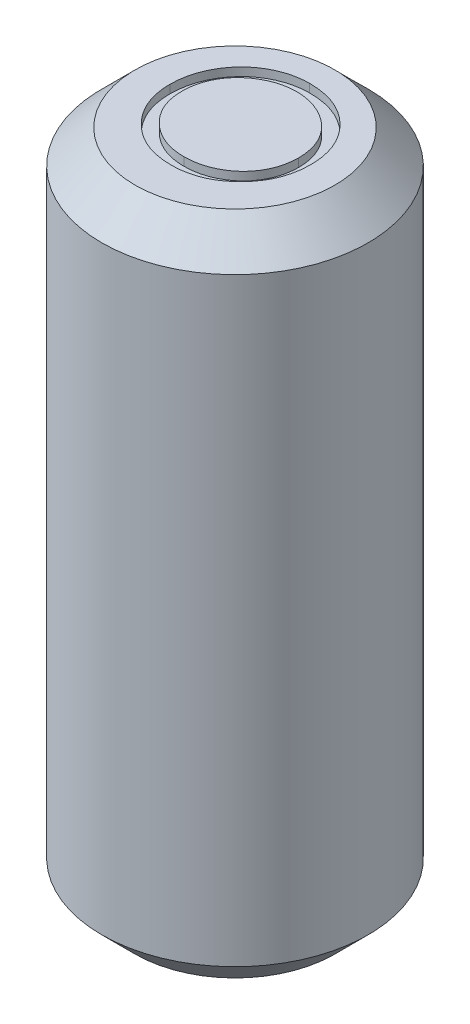
ISO-10303-21;
HEADER;
FILE_DESCRIPTION(('STEP AP214'),'2;1');
FILE_NAME('part.step','',(''),(''),'','','');
FILE_SCHEMA(('AUTOMOTIVE_DESIGN { 1 0 10303 214 1 1 1 1 }'));
ENDSEC;
DATA;
#1=APPLICATION_CONTEXT('core data for automotive mechanical design processes');
#2=APPLICATION_PROTOCOL_DEFINITION('international standard','automotive_design',2000,#1);
#3=PRODUCT_CONTEXT('',#1,'mechanical');
#4=PRODUCT('Part','Part','',(#3));
#5=PRODUCT_RELATED_PRODUCT_CATEGORY('part','',(#4));
#6=PRODUCT_DEFINITION_FORMATION('','',#4);
#7=PRODUCT_DEFINITION_CONTEXT('part definition',#1,'design');
#8=PRODUCT_DEFINITION('design','',#6,#7);
#9=PRODUCT_DEFINITION_SHAPE('','',#8);
#10=(LENGTH_UNIT() NAMED_UNIT(*) SI_UNIT(.MILLI.,.METRE.));
#11=(NAMED_UNIT(*) PLANE_ANGLE_UNIT() SI_UNIT($,.RADIAN.));
#12=(NAMED_UNIT(*) SI_UNIT($,.STERADIAN.) SOLID_ANGLE_UNIT());
#13=UNCERTAINTY_MEASURE_WITH_UNIT(LENGTH_MEASURE(1.E-05),#10,'distance_accuracy_value','');
#14=(GEOMETRIC_REPRESENTATION_CONTEXT(3) GLOBAL_UNCERTAINTY_ASSIGNED_CONTEXT((#13)) GLOBAL_UNIT_ASSIGNED_CONTEXT((#10,
#11,#12)) REPRESENTATION_CONTEXT('',''));
#15=CARTESIAN_POINT('',(0.,0.,0.));
#16=DIRECTION('',(0.,0.,1.));
#17=DIRECTION('',(1.,0.,0.));
#18=AXIS2_PLACEMENT_3D('',#15,#16,#17);
#19=CARTESIAN_POINT('',(0.,20.,0.));
#20=DIRECTION('',(0.,1.,0.));
#21=DIRECTION('',(0.,0.,1.));
#22=AXIS2_PLACEMENT_3D('',#19,#20,#21);
#23=PLANE('',#22);
#24=CARTESIAN_POINT('',(0.,20.,0.));
#25=DIRECTION('',(0.,1.,0.));
#26=DIRECTION('',(0.,0.,1.));
#27=AXIS2_PLACEMENT_3D('',#24,#25,#26);
#28=CIRCLE('',#27,3.);
#29=CARTESIAN_POINT('',(0.,20.,3.));
#30=VERTEX_POINT('',#29);
#31=EDGE_CURVE('E11',#30,#30,#28,.T.);
#32=ORIENTED_EDGE('',*,*,#31,.T.);
#33=EDGE_LOOP('',(#32));
#34=FACE_BOUND('',#33,.T.);
#35=CARTESIAN_POINT('',(0.00800634069132635,20.,1.93656942691081));
#36=CARTESIAN_POINT('',(-0.0644785952853353,20.,1.93479869907733));
#37=CARTESIAN_POINT('',(-0.207365699214886,20.,1.93130812315886));
#38=CARTESIAN_POINT('',(-0.417122311077475,20.,1.90138651767081));
#39=CARTESIAN_POINT('',(-0.618582589760647,20.,1.85459645618371));
#40=CARTESIAN_POINT('',(-0.811170419717619,20.,1.7877285290768));
#41=CARTESIAN_POINT('',(-0.9949931964016,20.,1.70130883681984));
#42=CARTESIAN_POINT('',(-1.1704104337668,20.,1.59593240360267));
#43=CARTESIAN_POINT('',(-1.33671803061441,20.,1.47089567082481));
#44=CARTESIAN_POINT('',(-1.49253716945386,20.,1.32899101416083));
#45=CARTESIAN_POINT('',(-1.63510768166237,20.,1.1745092404285));
#46=CARTESIAN_POINT('',(-1.75940411102568,20.,1.00898437748199));
#47=CARTESIAN_POINT('',(-1.86480424053333,20.,0.835663855603746));
#48=CARTESIAN_POINT('',(-1.95093376338506,20.,0.65406668518924));
#49=CARTESIAN_POINT('',(-2.01912171692187,20.,0.465070750672939));
#50=CARTESIAN_POINT('',(-2.06564150908083,20.,0.267415347827843));
#51=CARTESIAN_POINT('',(-2.09573974001665,20.,0.0622273411823689));
#52=CARTESIAN_POINT('',(-2.09920813599577,20.,-0.0774788283322625));
#53=CARTESIAN_POINT('',(-2.10096801828303,20.,-0.148366470525088));
#54=B_SPLINE_CURVE_WITH_KNOTS('',3,(#35,#36,#37,#38,#39,#40,#41,#42,#43,#44,#45,#46,#47,#48,#49,
#50,#51,#52,#53),.UNSPECIFIED.,.F.,.F.,(4,1,1,1,1,1,1,1,1,1,1,1,1,1,1,1,4),(0.,
0.065818876843307,0.129746526906831,0.192071954488006,0.253459424298202,0.31456958779642,
0.376279881188026,0.43902565366856,0.503267028829086,0.567492822879295,0.629704795605245,
0.690999649215756,0.751451650917447,0.812004364264694,0.873149681068043,0.935635483731786,1.),.UNSPECIFIED.);
#55=CARTESIAN_POINT('',(0.00800634069132635,20.,1.93656942691081));
#56=VERTEX_POINT('',#55);
#57=CARTESIAN_POINT('',(-2.10096801828303,20.,-0.148366470525088));
#58=VERTEX_POINT('',#57);
#59=EDGE_CURVE('E189',#56,#58,#54,.T.);
#60=ORIENTED_EDGE('',*,*,#59,.T.);
#61=CARTESIAN_POINT('',(-2.10096801828303,20.,-0.148366470525088));
#62=CARTESIAN_POINT('',(-2.10035700627719,20.,-0.195946663824122));
#63=CARTESIAN_POINT('',(-2.0991426904556,20.,-0.290506804974538));
#64=CARTESIAN_POINT('',(-2.08452361334838,20.,-0.430925776577204));
#65=CARTESIAN_POINT('',(-2.06331024054069,20.,-0.569086528310917));
#66=CARTESIAN_POINT('',(-2.03290805476995,20.,-0.704596183127278));
#67=CARTESIAN_POINT('',(-1.99314614964253,20.,-0.837123022787051));
#68=CARTESIAN_POINT('',(-1.9462295469108,20.,-0.96758103745716));
#69=CARTESIAN_POINT('',(-1.88892686650221,20.,-1.09464815030907));
#70=CARTESIAN_POINT('',(-1.82414898302925,20.,-1.21892631226464));
#71=CARTESIAN_POINT('',(-1.7518497738603,20.,-1.33847820464897));
#72=CARTESIAN_POINT('',(-1.67199177448661,20.,-1.45148344253597));
#73=CARTESIAN_POINT('',(-1.58737992480904,20.,-1.5588902960014));
#74=CARTESIAN_POINT('',(-1.4946217606627,20.,-1.65791544324601));
#75=CARTESIAN_POINT('',(-1.39677439472501,20.,-1.75143962197737));
#76=CARTESIAN_POINT('',(-1.29225053400018,20.,-1.83802558428619));
#77=CARTESIAN_POINT('',(-1.18168796901098,20.,-1.9184540996651));
#78=CARTESIAN_POINT('',(-1.06461096356459,20.,-1.99093448947131));
#79=CARTESIAN_POINT('',(-0.943904363702241,20.,-2.05648778617513));
#80=CARTESIAN_POINT('',(-0.819473760525815,20.,-2.1127413301554));
#81=CARTESIAN_POINT('',(-0.693009107376504,20.,-2.16102254331031));
#82=CARTESIAN_POINT('',(-0.563918081175945,20.,-2.20015491496406));
#83=CARTESIAN_POINT('',(-0.4325434845127,20.,-2.23104867038349));
#84=CARTESIAN_POINT('',(-0.298598587857987,20.,-2.25208564605075));
#85=CARTESIAN_POINT('',(-0.162190100681486,20.,-2.26674200935073));
#86=CARTESIAN_POINT('',(-0.070291450452931,20.,-2.2679505830528));
#87=CARTESIAN_POINT('',(-0.0240449413599557,20.,-2.2685587782174));
#88=B_SPLINE_CURVE_WITH_KNOTS('',3,(#61,#62,#63,#64,#65,#66,#67,#68,#69,#70,#71,#72,#73,#74,#75,
#76,#77,#78,#79,#80,#81,#82,#83,#84,#85,#86,#87),.UNSPECIFIED.,.F.,.F.,(4,1,1,1,1,1,1,1,1,1,1,1,
1,1,1,1,1,1,1,1,1,1,1,1,4),(0.,0.0432089861713366,0.0858728716306187,0.128120006696703,
0.170151964454199,0.211917620987861,0.253753002619124,0.296006408855951,0.338443357144784,
0.381015368162034,0.422820479440761,0.464089055794313,0.505125848683686,0.545974970685241,
0.58698521113386,0.628338591634663,0.670083801591206,0.711991602363722,0.753039154863019,
0.794049395311638,0.834885542701582,0.875498312929513,0.916547299830379,0.958003778644961,1.),.UNSPECIFIED.);
#89=CARTESIAN_POINT('',(-0.0240449413599557,20.,-2.2685587782174));
#90=VERTEX_POINT('',#89);
#91=EDGE_CURVE('E48',#58,#90,#88,.T.);
#92=ORIENTED_EDGE('',*,*,#91,.T.);
#93=CARTESIAN_POINT('',(-0.0240449413599557,20.,-2.2685587782174));
#94=CARTESIAN_POINT('',(0.0500214653920823,20.,-2.26668280179332));
#95=CARTESIAN_POINT('',(0.195493999056144,20.,-2.26299822932017));
#96=CARTESIAN_POINT('',(0.409293882169266,20.,-2.2347935395426));
#97=CARTESIAN_POINT('',(0.613402562494487,20.,-2.18599880815166));
#98=CARTESIAN_POINT('',(0.80948272112509,20.,-2.12101254245939));
#99=CARTESIAN_POINT('',(0.99518898006132,20.,-2.03432181630993));
#100=CARTESIAN_POINT('',(1.1719191429077,20.,-1.9295387896362));
#101=CARTESIAN_POINT('',(1.33925271299407,20.,-1.80556569391247));
#102=CARTESIAN_POINT('',(1.49493429188368,20.,-1.66336086322492));
#103=CARTESIAN_POINT('',(1.63739937792163,20.,-1.50863691590884));
#104=CARTESIAN_POINT('',(1.76291467651509,20.,-1.34351930439693));
#105=CARTESIAN_POINT('',(1.86810586935134,20.,-1.16900638747503));
#106=CARTESIAN_POINT('',(1.95448962611162,20.,-0.985622581027338));
#107=CARTESIAN_POINT('',(2.0222594657617,20.,-0.793782617627749));
#108=CARTESIAN_POINT('',(2.06902408712239,20.,-0.592463757351888));
#109=CARTESIAN_POINT('',(2.09889625872575,20.,-0.382970397269541));
#110=CARTESIAN_POINT('',(2.10238857576284,20.,-0.240082551870973));
#111=CARTESIAN_POINT('',(2.10416018684517,20.,-0.167597239755858));
#112=B_SPLINE_CURVE_WITH_KNOTS('',3,(#93,#94,#95,#96,#97,#98,#99,#100,#101,#102,#103,#104,#105,
#106,#107,#108,#109,#110,#111),.UNSPECIFIED.,.F.,.F.,(4,1,1,1,1,1,1,1,1,1,1,1,1,1,1,1,4),(0.,
0.0665700352151801,0.130749041482178,0.193412800029504,0.254989398889709,0.3161135558759,
0.377261757908984,0.439400784155553,0.502970589371976,0.566524976360731,0.628231102513309,
0.689090610599863,0.749344668995804,0.810169593372207,0.871609824317044,0.934869184072764,1.),.UNSPECIFIED.);
#113=CARTESIAN_POINT('',(2.10416018684517,20.,-0.167597239755858));
#114=VERTEX_POINT('',#113);
#115=EDGE_CURVE('E173',#90,#114,#112,.T.);
#116=ORIENTED_EDGE('',*,*,#115,.T.);
#117=CARTESIAN_POINT('',(2.10416018684517,20.,-0.167597239755858));
#118=CARTESIAN_POINT('',(2.10238883538907,20.,-0.095645872491213));
#119=CARTESIAN_POINT('',(2.09889729645682,20.,0.0461786080024725));
#120=CARTESIAN_POINT('',(2.0689901221305,20.,0.254342544197576));
#121=CARTESIAN_POINT('',(2.02208612216019,20.,0.454446197320116));
#122=CARTESIAN_POINT('',(1.95511896080863,20.,0.646155514777172));
#123=CARTESIAN_POINT('',(1.86914698542202,20.,0.829672730508615));
#124=CARTESIAN_POINT('',(1.76325536127237,20.,1.00451496351645));
#125=CARTESIAN_POINT('',(1.63852254899564,20.,1.17073953310035));
#126=CARTESIAN_POINT('',(1.49657186210042,20.,1.32652543621313));
#127=CARTESIAN_POINT('',(1.34182781408436,20.,1.46937968843439));
#128=CARTESIAN_POINT('',(1.17585036630269,20.,1.59385840350144));
#129=CARTESIAN_POINT('',(1.00237228639181,20.,1.70097168875732));
#130=CARTESIAN_POINT('',(0.819161191352543,20.,1.78643874471759));
#131=CARTESIAN_POINT('',(0.628646863550889,20.,1.85474951094054));
#132=CARTESIAN_POINT('',(0.429124208592603,20.,1.90132394526212));
#133=CARTESIAN_POINT('',(0.221528146832157,20.,1.93136628040733));
#134=CARTESIAN_POINT('',(0.0799612853434925,20.,1.93481601293665));
#135=CARTESIAN_POINT('',(0.00800634069132635,20.,1.93656942691081));
#136=B_SPLINE_CURVE_WITH_KNOTS('',3,(#117,#118,#119,#120,#121,#122,#123,#124,#125,#126,#127,
#128,#129,#130,#131,#132,#133,#134,#135),.UNSPECIFIED.,.F.,.F.,(4,1,1,1,1,1,1,1,1,1,1,1,1,1,1,1,
4),(0.,0.0652265038922758,0.128568995706729,0.190320378104467,0.251377988624063,
0.312387528333694,0.373788704276724,0.43643115978045,0.500566755309854,0.564686795384744,
0.627135517883514,0.68845540889498,0.749245746463747,0.810155177364678,0.871670925652923,
0.934773496107724,1.),.UNSPECIFIED.);
#137=EDGE_CURVE('E181',#114,#56,#136,.T.);
#138=ORIENTED_EDGE('',*,*,#137,.T.);
#139=EDGE_LOOP('',(#60,#92,#116,#138));
#140=FACE_BOUND('',#139,.T.);
#141=ADVANCED_FACE('F33',(#34,#140),#23,.T.);
#142=CARTESIAN_POINT('',(0.,20.,0.));
#143=DIRECTION('',(0.,-1.,0.));
#144=DIRECTION('',(0.,0.,-1.));
#145=AXIS2_PLACEMENT_3D('',#142,#143,#144);
#146=CYLINDRICAL_SURFACE('',#145,4.);
#147=CARTESIAN_POINT('',(0.,1.,0.));
#148=DIRECTION('',(0.,1.,0.));
#149=DIRECTION('',(0.,0.,1.));
#150=AXIS2_PLACEMENT_3D('',#147,#148,#149);
#151=CIRCLE('',#150,4.);
#152=CARTESIAN_POINT('',(0.,1.,4.));
#153=VERTEX_POINT('',#152);
#154=EDGE_CURVE('E211',#153,#153,#151,.T.);
#155=ORIENTED_EDGE('',*,*,#154,.T.);
#156=EDGE_LOOP('',(#155));
#157=FACE_BOUND('',#156,.T.);
#158=CARTESIAN_POINT('',(0.,19.,0.));
#159=DIRECTION('',(0.,1.,0.));
#160=DIRECTION('',(0.,0.,1.));
#161=AXIS2_PLACEMENT_3D('',#158,#159,#160);
#162=CIRCLE('',#161,4.);
#163=CARTESIAN_POINT('',(0.,19.,4.));
#164=VERTEX_POINT('',#163);
#165=EDGE_CURVE('E208',#164,#164,#162,.F.);
#166=ORIENTED_EDGE('',*,*,#165,.T.);
#167=EDGE_LOOP('',(#166));
#168=FACE_BOUND('',#167,.T.);
#169=ADVANCED_FACE('F223',(#157,#168),#146,.T.);
#170=CARTESIAN_POINT('',(0.,0.,0.));
#171=DIRECTION('',(0.,1.,0.));
#172=DIRECTION('',(0.,0.,1.));
#173=AXIS2_PLACEMENT_3D('',#170,#171,#172);
#174=PLANE('',#173);
#175=CARTESIAN_POINT('',(0.,0.,0.));
#176=DIRECTION('',(0.,1.,0.));
#177=DIRECTION('',(0.,0.,1.));
#178=AXIS2_PLACEMENT_3D('',#175,#176,#177);
#179=CIRCLE('',#178,2.99999999999999);
#180=CARTESIAN_POINT('',(0.,0.,2.99999999999999));
#181=VERTEX_POINT('',#180);
#182=EDGE_CURVE('E41',#181,#181,#179,.F.);
#183=ORIENTED_EDGE('',*,*,#182,.T.);
#184=EDGE_LOOP('',(#183));
#185=FACE_BOUND('',#184,.T.);
#186=ADVANCED_FACE('F216',(#185),#174,.F.);
#187=CARTESIAN_POINT('',(0.,1.,0.));
#188=DIRECTION('',(0.,1.,0.));
#189=DIRECTION('',(0.,0.,1.));
#190=AXIS2_PLACEMENT_3D('',#187,#188,#189);
#191=CONICAL_SURFACE('',#190,4.,0.785398163397451);
#192=ORIENTED_EDGE('',*,*,#182,.F.);
#193=EDGE_LOOP('',(#192));
#194=FACE_BOUND('',#193,.T.);
#195=ORIENTED_EDGE('',*,*,#154,.F.);
#196=EDGE_LOOP('',(#195));
#197=FACE_BOUND('',#196,.T.);
#198=ADVANCED_FACE('F218',(#194,#197),#191,.T.);
#199=CARTESIAN_POINT('',(0.,20.,0.));
#200=DIRECTION('',(0.,-1.,0.));
#201=DIRECTION('',(0.,0.,-1.));
#202=AXIS2_PLACEMENT_3D('',#199,#200,#201);
#203=CONICAL_SURFACE('',#202,3.,0.785398163397446);
#204=ORIENTED_EDGE('',*,*,#165,.F.);
#205=EDGE_LOOP('',(#204));
#206=FACE_BOUND('',#205,.T.);
#207=ORIENTED_EDGE('',*,*,#31,.F.);
#208=EDGE_LOOP('',(#207));
#209=FACE_BOUND('',#208,.T.);
#210=ADVANCED_FACE('F35',(#206,#209),#203,.T.);
#211=CARTESIAN_POINT('',(-2.10096801828303,19.75,-0.148366470525088));
#212=CARTESIAN_POINT('',(-2.10035700627719,19.75,-0.195946663824122));
#213=CARTESIAN_POINT('',(-2.0991426904556,19.75,-0.290506804974538));
#214=CARTESIAN_POINT('',(-2.08452361334838,19.75,-0.430925776577204));
#215=CARTESIAN_POINT('',(-2.06331024054069,19.75,-0.569086528310917));
#216=CARTESIAN_POINT('',(-2.03290805476995,19.75,-0.704596183127278));
#217=CARTESIAN_POINT('',(-1.99314614964253,19.75,-0.837123022787051));
#218=CARTESIAN_POINT('',(-1.9462295469108,19.75,-0.96758103745716));
#219=CARTESIAN_POINT('',(-1.88892686650221,19.75,-1.09464815030907));
#220=CARTESIAN_POINT('',(-1.82414898302925,19.75,-1.21892631226464));
#221=CARTESIAN_POINT('',(-1.7518497738603,19.75,-1.33847820464897));
#222=CARTESIAN_POINT('',(-1.67199177448661,19.75,-1.45148344253597));
#223=CARTESIAN_POINT('',(-1.58737992480904,19.75,-1.5588902960014));
#224=CARTESIAN_POINT('',(-1.4946217606627,19.75,-1.65791544324601));
#225=CARTESIAN_POINT('',(-1.39677439472501,19.75,-1.75143962197737));
#226=CARTESIAN_POINT('',(-1.29225053400018,19.75,-1.83802558428619));
#227=CARTESIAN_POINT('',(-1.18168796901098,19.75,-1.9184540996651));
#228=CARTESIAN_POINT('',(-1.06461096356459,19.75,-1.99093448947131));
#229=CARTESIAN_POINT('',(-0.943904363702241,19.75,-2.05648778617513));
#230=CARTESIAN_POINT('',(-0.819473760525815,19.75,-2.1127413301554));
#231=CARTESIAN_POINT('',(-0.693009107376504,19.75,-2.16102254331031));
#232=CARTESIAN_POINT('',(-0.563918081175945,19.75,-2.20015491496406));
#233=CARTESIAN_POINT('',(-0.4325434845127,19.75,-2.23104867038349));
#234=CARTESIAN_POINT('',(-0.298598587857987,19.75,-2.25208564605075));
#235=CARTESIAN_POINT('',(-0.162190100681486,19.75,-2.26674200935073));
#236=CARTESIAN_POINT('',(-0.070291450452931,19.75,-2.2679505830528));
#237=CARTESIAN_POINT('',(-0.0240449413599557,19.75,-2.2685587782174));
#238=B_SPLINE_CURVE_WITH_KNOTS('',3,(#211,#212,#213,#214,#215,#216,#217,#218,#219,#220,#221,
#222,#223,#224,#225,#226,#227,#228,#229,#230,#231,#232,#233,#234,#235,#236,#237),.UNSPECIFIED.,
.F.,.F.,(4,1,1,1,1,1,1,1,1,1,1,1,1,1,1,1,1,1,1,1,1,1,1,1,4),(0.,0.0432089861713366,
0.0858728716306187,0.128120006696703,0.170151964454199,0.211917620987861,0.253753002619124,
0.296006408855951,0.338443357144784,0.381015368162034,0.422820479440761,0.464089055794313,
0.505125848683686,0.545974970685241,0.58698521113386,0.628338591634663,0.670083801591206,
0.711991602363722,0.753039154863019,0.794049395311638,0.834885542701582,0.875498312929513,
0.916547299830379,0.958003778644961,1.),.UNSPECIFIED.);
#239=DIRECTION('',(0.,1.,0.));
#240=VECTOR('',#239,1.);
#241=SURFACE_OF_LINEAR_EXTRUSION('',#238,#240);
#242=ORIENTED_EDGE('',*,*,#91,.F.);
#243=DIRECTION('',(0.,1.,0.));
#244=VECTOR('',#243,1.);
#245=CARTESIAN_POINT('',(-2.10096801828303,19.75,-0.148366470525088));
#246=LINE('',#245,#244);
#247=CARTESIAN_POINT('',(-2.10096801828303,19.75,-0.148366470525088));
#248=VERTEX_POINT('',#247);
#249=EDGE_CURVE('E161',#248,#58,#246,.T.);
#250=ORIENTED_EDGE('',*,*,#249,.F.);
#251=CARTESIAN_POINT('',(-0.0240449413599557,19.75,-2.2685587782174));
#252=VERTEX_POINT('',#251);
#253=EDGE_CURVE('E197',#248,#252,#238,.T.);
#254=ORIENTED_EDGE('',*,*,#253,.T.);
#255=DIRECTION('',(0.,1.,0.));
#256=VECTOR('',#255,1.);
#257=CARTESIAN_POINT('',(-0.0240449413599557,19.75,-2.2685587782174));
#258=LINE('',#257,#256);
#259=EDGE_CURVE('E206',#252,#90,#258,.T.);
#260=ORIENTED_EDGE('',*,*,#259,.T.);
#261=EDGE_LOOP('',(#242,#250,#254,#260));
#262=FACE_BOUND('',#261,.T.);
#263=ADVANCED_FACE('F231',(#262),#241,.T.);
#264=CARTESIAN_POINT('',(-0.0240449413599557,19.75,-2.2685587782174));
#265=CARTESIAN_POINT('',(0.0500214653920823,19.75,-2.26668280179332));
#266=CARTESIAN_POINT('',(0.195493999056144,19.75,-2.26299822932017));
#267=CARTESIAN_POINT('',(0.409293882169266,19.75,-2.2347935395426));
#268=CARTESIAN_POINT('',(0.613402562494487,19.75,-2.18599880815166));
#269=CARTESIAN_POINT('',(0.80948272112509,19.75,-2.12101254245939));
#270=CARTESIAN_POINT('',(0.99518898006132,19.75,-2.03432181630993));
#271=CARTESIAN_POINT('',(1.1719191429077,19.75,-1.9295387896362));
#272=CARTESIAN_POINT('',(1.33925271299407,19.75,-1.80556569391247));
#273=CARTESIAN_POINT('',(1.49493429188368,19.75,-1.66336086322492));
#274=CARTESIAN_POINT('',(1.63739937792163,19.75,-1.50863691590884));
#275=CARTESIAN_POINT('',(1.76291467651509,19.75,-1.34351930439693));
#276=CARTESIAN_POINT('',(1.86810586935134,19.75,-1.16900638747503));
#277=CARTESIAN_POINT('',(1.95448962611162,19.75,-0.985622581027338));
#278=CARTESIAN_POINT('',(2.0222594657617,19.75,-0.793782617627749));
#279=CARTESIAN_POINT('',(2.06902408712239,19.75,-0.592463757351888));
#280=CARTESIAN_POINT('',(2.09889625872575,19.75,-0.382970397269541));
#281=CARTESIAN_POINT('',(2.10238857576284,19.75,-0.240082551870973));
#282=CARTESIAN_POINT('',(2.10416018684517,19.75,-0.167597239755858));
#283=B_SPLINE_CURVE_WITH_KNOTS('',3,(#264,#265,#266,#267,#268,#269,#270,#271,#272,#273,#274,
#275,#276,#277,#278,#279,#280,#281,#282),.UNSPECIFIED.,.F.,.F.,(4,1,1,1,1,1,1,1,1,1,1,1,1,1,1,1,
4),(0.,0.0665700352151801,0.130749041482178,0.193412800029504,0.254989398889709,0.3161135558759,
0.377261757908984,0.439400784155553,0.502970589371976,0.566524976360731,0.628231102513309,
0.689090610599863,0.749344668995804,0.810169593372207,0.871609824317044,0.934869184072764,1.),.UNSPECIFIED.);
#284=DIRECTION('',(0.,1.,0.));
#285=VECTOR('',#284,1.);
#286=SURFACE_OF_LINEAR_EXTRUSION('',#283,#285);
#287=ORIENTED_EDGE('',*,*,#115,.F.);
#288=ORIENTED_EDGE('',*,*,#259,.F.);
#289=CARTESIAN_POINT('',(2.10416018684517,19.75,-0.167597239755858));
#290=VERTEX_POINT('',#289);
#291=EDGE_CURVE('E246',#252,#290,#283,.T.);
#292=ORIENTED_EDGE('',*,*,#291,.T.);
#293=DIRECTION('',(0.,1.,0.));
#294=VECTOR('',#293,1.);
#295=CARTESIAN_POINT('',(2.10416018684517,19.75,-0.167597239755858));
#296=LINE('',#295,#294);
#297=EDGE_CURVE('E204',#290,#114,#296,.T.);
#298=ORIENTED_EDGE('',*,*,#297,.T.);
#299=EDGE_LOOP('',(#287,#288,#292,#298));
#300=FACE_BOUND('',#299,.T.);
#301=ADVANCED_FACE('F260',(#300),#286,.T.);
#302=CARTESIAN_POINT('',(2.10416018684517,19.75,-0.167597239755858));
#303=CARTESIAN_POINT('',(2.10238883538907,19.75,-0.095645872491213));
#304=CARTESIAN_POINT('',(2.09889729645682,19.75,0.0461786080024725));
#305=CARTESIAN_POINT('',(2.0689901221305,19.75,0.254342544197576));
#306=CARTESIAN_POINT('',(2.02208612216019,19.75,0.454446197320116));
#307=CARTESIAN_POINT('',(1.95511896080863,19.75,0.646155514777172));
#308=CARTESIAN_POINT('',(1.86914698542202,19.75,0.829672730508615));
#309=CARTESIAN_POINT('',(1.76325536127237,19.75,1.00451496351645));
#310=CARTESIAN_POINT('',(1.63852254899564,19.75,1.17073953310035));
#311=CARTESIAN_POINT('',(1.49657186210042,19.75,1.32652543621313));
#312=CARTESIAN_POINT('',(1.34182781408436,19.75,1.46937968843439));
#313=CARTESIAN_POINT('',(1.17585036630269,19.75,1.59385840350144));
#314=CARTESIAN_POINT('',(1.00237228639181,19.75,1.70097168875732));
#315=CARTESIAN_POINT('',(0.819161191352543,19.75,1.78643874471759));
#316=CARTESIAN_POINT('',(0.628646863550889,19.75,1.85474951094054));
#317=CARTESIAN_POINT('',(0.429124208592603,19.75,1.90132394526212));
#318=CARTESIAN_POINT('',(0.221528146832157,19.75,1.93136628040733));
#319=CARTESIAN_POINT('',(0.0799612853434925,19.75,1.93481601293665));
#320=CARTESIAN_POINT('',(0.00800634069132635,19.75,1.93656942691081));
#321=B_SPLINE_CURVE_WITH_KNOTS('',3,(#302,#303,#304,#305,#306,#307,#308,#309,#310,#311,#312,
#313,#314,#315,#316,#317,#318,#319,#320),.UNSPECIFIED.,.F.,.F.,(4,1,1,1,1,1,1,1,1,1,1,1,1,1,1,1,
4),(0.,0.0652265038922758,0.128568995706729,0.190320378104467,0.251377988624063,
0.312387528333694,0.373788704276724,0.43643115978045,0.500566755309854,0.564686795384744,
0.627135517883514,0.68845540889498,0.749245746463747,0.810155177364678,0.871670925652923,
0.934773496107724,1.),.UNSPECIFIED.);
#322=DIRECTION('',(0.,1.,0.));
#323=VECTOR('',#322,1.);
#324=SURFACE_OF_LINEAR_EXTRUSION('',#321,#323);
#325=ORIENTED_EDGE('',*,*,#137,.F.);
#326=ORIENTED_EDGE('',*,*,#297,.F.);
#327=CARTESIAN_POINT('',(0.00800634069132635,19.75,1.93656942691081));
#328=VERTEX_POINT('',#327);
#329=EDGE_CURVE('E162',#290,#328,#321,.T.);
#330=ORIENTED_EDGE('',*,*,#329,.T.);
#331=DIRECTION('',(0.,1.,0.));
#332=VECTOR('',#331,1.);
#333=CARTESIAN_POINT('',(0.00800634069132635,19.75,1.93656942691081));
#334=LINE('',#333,#332);
#335=EDGE_CURVE('E202',#328,#56,#334,.T.);
#336=ORIENTED_EDGE('',*,*,#335,.T.);
#337=EDGE_LOOP('',(#325,#326,#330,#336));
#338=FACE_BOUND('',#337,.T.);
#339=ADVANCED_FACE('F152',(#338),#324,.T.);
#340=CARTESIAN_POINT('',(0.00800634069132635,19.75,1.93656942691081));
#341=CARTESIAN_POINT('',(-0.0644785952853353,19.75,1.93479869907733));
#342=CARTESIAN_POINT('',(-0.207365699214886,19.75,1.93130812315886));
#343=CARTESIAN_POINT('',(-0.417122311077475,19.75,1.90138651767081));
#344=CARTESIAN_POINT('',(-0.618582589760647,19.75,1.85459645618371));
#345=CARTESIAN_POINT('',(-0.811170419717619,19.75,1.7877285290768));
#346=CARTESIAN_POINT('',(-0.9949931964016,19.75,1.70130883681984));
#347=CARTESIAN_POINT('',(-1.1704104337668,19.75,1.59593240360267));
#348=CARTESIAN_POINT('',(-1.33671803061441,19.75,1.47089567082481));
#349=CARTESIAN_POINT('',(-1.49253716945386,19.75,1.32899101416083));
#350=CARTESIAN_POINT('',(-1.63510768166237,19.75,1.1745092404285));
#351=CARTESIAN_POINT('',(-1.75940411102568,19.75,1.00898437748199));
#352=CARTESIAN_POINT('',(-1.86480424053333,19.75,0.835663855603746));
#353=CARTESIAN_POINT('',(-1.95093376338506,19.75,0.65406668518924));
#354=CARTESIAN_POINT('',(-2.01912171692187,19.75,0.465070750672939));
#355=CARTESIAN_POINT('',(-2.06564150908083,19.75,0.267415347827843));
#356=CARTESIAN_POINT('',(-2.09573974001665,19.75,0.0622273411823689));
#357=CARTESIAN_POINT('',(-2.09920813599577,19.75,-0.0774788283322625));
#358=CARTESIAN_POINT('',(-2.10096801828303,19.75,-0.148366470525088));
#359=B_SPLINE_CURVE_WITH_KNOTS('',3,(#340,#341,#342,#343,#344,#345,#346,#347,#348,#349,#350,
#351,#352,#353,#354,#355,#356,#357,#358),.UNSPECIFIED.,.F.,.F.,(4,1,1,1,1,1,1,1,1,1,1,1,1,1,1,1,
4),(0.,0.065818876843307,0.129746526906831,0.192071954488006,0.253459424298202,0.31456958779642,
0.376279881188026,0.43902565366856,0.503267028829086,0.567492822879295,0.629704795605245,
0.690999649215756,0.751451650917447,0.812004364264694,0.873149681068043,0.935635483731786,1.),.UNSPECIFIED.);
#360=DIRECTION('',(0.,1.,0.));
#361=VECTOR('',#360,1.);
#362=SURFACE_OF_LINEAR_EXTRUSION('',#359,#361);
#363=ORIENTED_EDGE('',*,*,#59,.F.);
#364=ORIENTED_EDGE('',*,*,#335,.F.);
#365=EDGE_CURVE('E156',#328,#248,#359,.T.);
#366=ORIENTED_EDGE('',*,*,#365,.T.);
#367=ORIENTED_EDGE('',*,*,#249,.T.);
#368=EDGE_LOOP('',(#363,#364,#366,#367));
#369=FACE_BOUND('',#368,.T.);
#370=ADVANCED_FACE('F148',(#369),#362,.T.);
#371=CARTESIAN_POINT('',(-1.50546718282967,19.75,-1.64510565204306));
#372=DIRECTION('',(1.8783822154156E-12,1.,0.));
#373=DIRECTION('',(-1.,1.8783822154156E-12,0.));
#374=AXIS2_PLACEMENT_3D('',#371,#372,#373);
#375=PLANE('',#374);
#376=CARTESIAN_POINT('',(-0.00641673623175045,19.75,1.5263130166544));
#377=CARTESIAN_POINT('',(0.0331369798964824,19.75,1.52576958309305));
#378=CARTESIAN_POINT('',(0.111583878610247,19.75,1.52469179112513));
#379=CARTESIAN_POINT('',(0.228264475584859,19.75,1.51383616045445));
#380=CARTESIAN_POINT('',(0.342843003277379,19.75,1.49642830969084));
#381=CARTESIAN_POINT('',(0.455158751711982,19.75,1.47136470328072));
#382=CARTESIAN_POINT('',(0.565084250439377,19.75,1.43999646736291));
#383=CARTESIAN_POINT('',(0.673078311142173,19.75,1.40273049255254));
#384=CARTESIAN_POINT('',(0.777990642935927,19.75,1.35623768834322));
#385=CARTESIAN_POINT('',(0.881144743280129,19.75,1.30486860082434));
#386=CARTESIAN_POINT('',(0.979883305212891,19.75,1.2463084207862));
#387=CARTESIAN_POINT('',(1.07414105640241,19.75,1.18340767831842));
#388=CARTESIAN_POINT('',(1.16154217623656,19.75,1.11372925465005));
#389=CARTESIAN_POINT('',(1.24427254357477,19.75,1.04022318317119));
#390=CARTESIAN_POINT('',(1.32156133099487,19.75,0.961407357048671));
#391=CARTESIAN_POINT('',(1.39288588439505,19.75,0.877384246366508));
#392=CARTESIAN_POINT('',(1.45800603542379,19.75,0.787623495242899));
#393=CARTESIAN_POINT('',(1.51796677440552,19.75,0.693583031539721));
#394=CARTESIAN_POINT('',(1.571456217555,19.75,0.595301599899484));
#395=CARTESIAN_POINT('',(1.61806090218256,19.75,0.494124825101335));
#396=CARTESIAN_POINT('',(1.6575993202771,19.75,0.390301842967975));
#397=CARTESIAN_POINT('',(1.68951761151054,19.75,0.283682904132125));
#398=CARTESIAN_POINT('',(1.71452956771986,19.75,0.174470505536883));
#399=CARTESIAN_POINT('',(1.73176376190041,19.75,0.0625184162096262));
#400=CARTESIAN_POINT('',(1.74381912035412,19.75,-0.0519494037790663));
#401=CARTESIAN_POINT('',(1.74472777999603,19.75,-0.129370953449612));
#402=CARTESIAN_POINT('',(1.74518582787081,19.75,-0.16839852180714));
#403=B_SPLINE_CURVE_WITH_KNOTS('',3,(#376,#377,#378,#379,#380,#381,#382,#383,#384,#385,#386,
#387,#388,#389,#390,#391,#392,#393,#394,#395,#396,#397,#398,#399,#400,#401,#402),.UNSPECIFIED.,
.F.,.F.,(4,1,1,1,1,1,1,1,1,1,1,1,1,1,1,1,1,1,1,1,1,1,1,1,4),(0.,0.0436332182657581,
0.0865377766972012,0.129177336089892,0.171436323663829,0.213415894570908,0.25526595455385,
0.297369481156624,0.339940747898555,0.382347458751812,0.423952946815271,0.464871163261017,
0.505572294118273,0.546002577108316,0.586567974806913,0.627064799148168,0.668270684033174,
0.709549224850334,0.750428153513189,0.791096194448593,0.832027144779434,0.873135955335967,
0.914610764365449,0.956955986480437,1.),.UNSPECIFIED.);
#404=CARTESIAN_POINT('',(-0.00641673623175045,19.75,1.5263130166544));
#405=VERTEX_POINT('',#404);
#406=CARTESIAN_POINT('',(1.74518582787081,19.75,-0.16839852180714));
#407=VERTEX_POINT('',#406);
#408=EDGE_CURVE('E112',#405,#407,#403,.T.);
#409=ORIENTED_EDGE('',*,*,#408,.F.);
#410=CARTESIAN_POINT('',(-1.74199365930867,19.75,-0.149969034627653));
#411=CARTESIAN_POINT('',(-1.74053667421434,19.75,-0.0921836394242119));
#412=CARTESIAN_POINT('',(-1.73767033380052,19.75,0.0214981094447095));
#413=CARTESIAN_POINT('',(-1.71257596795445,19.75,0.188090273884642));
#414=CARTESIAN_POINT('',(-1.6739222828655,19.75,0.348191172563486));
#415=CARTESIAN_POINT('',(-1.61694243550926,19.75,0.500924783184649));
#416=CARTESIAN_POINT('',(-1.54568459018624,19.75,0.647603963563587));
#417=CARTESIAN_POINT('',(-1.45765385844376,19.75,0.786927511777803));
#418=CARTESIAN_POINT('',(-1.35335776065058,19.75,0.918933082479156));
#419=CARTESIAN_POINT('',(-1.23488515881995,19.75,1.04269910415885));
#420=CARTESIAN_POINT('',(-1.10537349413471,19.75,1.15566573757544));
#421=CARTESIAN_POINT('',(-0.967850374215868,19.75,1.25482391888411));
#422=CARTESIAN_POINT('',(-0.823789108516101,19.75,1.33872134725381));
#423=CARTESIAN_POINT('',(-0.672814019701838,19.75,1.40707000140625));
#424=CARTESIAN_POINT('',(-0.515731117954029,19.75,1.46122970174796));
#425=CARTESIAN_POINT('',(-0.35152820248267,19.75,1.49834813732229));
#426=CARTESIAN_POINT('',(-0.18129910581568,19.75,1.52277722917131));
#427=CARTESIAN_POINT('',(-0.0652640713469909,19.75,1.52512323593832));
#428=CARTESIAN_POINT('',(-0.00641673623175045,19.75,1.5263130166544));
#429=B_SPLINE_CURVE_WITH_KNOTS('',3,(#410,#411,#412,#413,#414,#415,#416,#417,#418,#419,#420,
#421,#422,#423,#424,#425,#426,#427,#428),.UNSPECIFIED.,.F.,.F.,(4,1,1,1,1,1,1,1,1,1,1,1,1,1,1,1,
4),(0.,0.0645039992970557,0.12689932159004,0.187746540100012,0.248149732929826,
0.308586064762742,0.369583005086994,0.431826965381049,0.496179722524157,0.560667854611879,
0.623504455117664,0.685260411330427,0.746536821751167,0.808327351736708,0.870486187887767,
0.934316883359246,1.),.UNSPECIFIED.);
#430=CARTESIAN_POINT('',(-1.74199365930867,19.75,-0.149969034627653));
#431=VERTEX_POINT('',#430);
#432=EDGE_CURVE('E122',#431,#405,#429,.T.);
#433=ORIENTED_EDGE('',*,*,#432,.F.);
#434=CARTESIAN_POINT('',(-0.00641673623175045,19.75,-1.85830236796099));
#435=CARTESIAN_POINT('',(-0.0443763174275782,19.75,-1.85783963624299));
#436=CARTESIAN_POINT('',(-0.119932583637377,19.75,-1.85691859655375));
#437=CARTESIAN_POINT('',(-0.232257767919372,19.75,-1.84478635018559));
#438=CARTESIAN_POINT('',(-0.343105692297439,19.75,-1.82749504850403));
#439=CARTESIAN_POINT('',(-0.452499249065006,19.75,-1.80283045334456));
#440=CARTESIAN_POINT('',(-0.559980722639641,19.75,-1.76922582160328));
#441=CARTESIAN_POINT('',(-0.666551969694603,19.75,-1.73055049795825));
#442=CARTESIAN_POINT('',(-0.771241174116027,19.75,-1.68344068013491));
#443=CARTESIAN_POINT('',(-0.873702725951862,19.75,-1.63021473228388));
#444=CARTESIAN_POINT('',(-0.973034240404425,19.75,-1.57130167993674));
#445=CARTESIAN_POINT('',(-1.06676304206701,19.75,-1.50619108903947));
#446=CARTESIAN_POINT('',(-1.15513177802558,19.75,-1.43640988418542));
#447=CARTESIAN_POINT('',(-1.23792408277154,19.75,-1.36179521289706));
#448=CARTESIAN_POINT('',(-1.31489685097097,19.75,-1.2819670965643));
#449=CARTESIAN_POINT('',(-1.3875650812027,19.75,-1.19813574100117));
#450=CARTESIAN_POINT('',(-1.45301603165536,19.75,-1.10790500837986));
#451=CARTESIAN_POINT('',(-1.51299954802897,19.75,-1.01372168624628));
#452=CARTESIAN_POINT('',(-1.56667707977452,19.75,-0.915708450582517));
#453=CARTESIAN_POINT('',(-1.61440891374309,19.75,-0.81489717941918));
#454=CARTESIAN_POINT('',(-1.65345349523509,19.75,-0.710465537386745));
#455=CARTESIAN_POINT('',(-1.68529621098843,19.75,-0.603546500156747));
#456=CARTESIAN_POINT('',(-1.71169599481329,19.75,-0.494309403398489));
#457=CARTESIAN_POINT('',(-1.72842047949254,19.75,-0.381925576153663));
#458=CARTESIAN_POINT('',(-1.74068603314814,19.75,-0.266959733834095));
#459=CARTESIAN_POINT('',(-1.7415544279511,19.75,-0.189266186357311));
#460=CARTESIAN_POINT('',(-1.74199365930867,19.75,-0.149969034627653));
#461=B_SPLINE_CURVE_WITH_KNOTS('',3,(#434,#435,#436,#437,#438,#439,#440,#441,#442,#443,#444,
#445,#446,#447,#448,#449,#450,#451,#452,#453,#454,#455,#456,#457,#458,#459,#460),.UNSPECIFIED.,
.F.,.F.,(4,1,1,1,1,1,1,1,1,1,1,1,1,1,1,1,1,1,1,1,1,1,1,1,4),(0.,0.0420233285259237,
0.0836449111687118,0.124983795417395,0.166247461172895,0.207701556096988,0.24963107079965,
0.291741770332131,0.334742875353198,0.377460168550865,0.41955631884194,0.461044176333034,
0.502096283944397,0.5428907140756,0.583800818626505,0.624863583310193,0.666224689069171,
0.707399186477936,0.748556677536693,0.78965459095218,0.830739726489833,0.872070142258605,
0.913993395242133,0.956498130067588,1.),.UNSPECIFIED.);
#462=CARTESIAN_POINT('',(-0.00641673623175045,19.75,-1.85830236796099));
#463=VERTEX_POINT('',#462);
#464=EDGE_CURVE('E104',#463,#431,#461,.T.);
#465=ORIENTED_EDGE('',*,*,#464,.F.);
#466=CARTESIAN_POINT('',(1.74518582787081,19.75,-0.16839852180714));
#467=CARTESIAN_POINT('',(1.74472741303862,19.75,-0.207159098113944));
#468=CARTESIAN_POINT('',(1.74381806277598,19.75,-0.284047841168767));
#469=CARTESIAN_POINT('',(1.73176952034814,19.75,-0.397717347867433));
#470=CARTESIAN_POINT('',(1.71451135992547,19.75,-0.508863875266089));
#471=CARTESIAN_POINT('',(1.68963969359458,19.75,-0.617051078690136));
#472=CARTESIAN_POINT('',(1.6575823750396,19.75,-0.722306535909285));
#473=CARTESIAN_POINT('',(1.61805399745235,19.75,-0.824531390424925));
#474=CARTESIAN_POINT('',(1.5714422266251,19.75,-0.924106470520048));
#475=CARTESIAN_POINT('',(1.51794711304606,19.75,-1.02078566709125));
#476=CARTESIAN_POINT('',(1.45781474335875,19.75,-1.1135567962198));
#477=CARTESIAN_POINT('',(1.39210703671771,19.75,-1.20224526767744));
#478=CARTESIAN_POINT('',(1.31968949598498,19.75,-1.28518554346096));
#479=CARTESIAN_POINT('',(1.24263118184351,19.75,-1.36442519379627));
#480=CARTESIAN_POINT('',(1.15900731289597,19.75,-1.4382742104909));
#481=CARTESIAN_POINT('',(1.06919669109124,19.75,-1.50675709124237));
#482=CARTESIAN_POINT('',(0.974289630792428,19.75,-1.57152654757258));
#483=CARTESIAN_POINT('',(0.873801361726146,19.75,-1.62995576110475));
#484=CARTESIAN_POINT('',(0.770093986032594,19.75,-1.68391488420555));
#485=CARTESIAN_POINT('',(0.663678034063927,19.75,-1.73014460208509));
#486=CARTESIAN_POINT('',(0.55575906307391,19.75,-1.76942702424208));
#487=CARTESIAN_POINT('',(0.446611506122903,19.75,-1.80293212715702));
#488=CARTESIAN_POINT('',(0.335316673739602,19.75,-1.82739844732173));
#489=CARTESIAN_POINT('',(0.222626583628846,19.75,-1.84480193287602));
#490=CARTESIAN_POINT('',(0.108697145256742,19.75,-1.85691437389708));
#491=CARTESIAN_POINT('',(0.0320763227155247,19.75,-1.85783823508118));
#492=CARTESIAN_POINT('',(-0.00641673623175045,19.75,-1.85830236796099));
#493=B_SPLINE_CURVE_WITH_KNOTS('',3,(#466,#467,#468,#469,#470,#471,#472,#473,#474,#475,#476,
#477,#478,#479,#480,#481,#482,#483,#484,#485,#486,#487,#488,#489,#490,#491,#492),.UNSPECIFIED.,
.F.,.F.,(4,1,1,1,1,1,1,1,1,1,1,1,1,1,1,1,1,1,1,1,1,1,1,1,4),(0.,0.0429150821010497,
0.0851299705846991,0.126473318554998,0.167453037885389,0.207976332894988,0.24824937806376,
0.288749986983443,0.329669856910873,0.370537286711975,0.411128563917117,0.451818912673638,
0.492405876934264,0.533485861742023,0.575263062441551,0.617440612802191,0.660671688292365,
0.703940204243489,0.74686752215987,0.789079300394723,0.831104042457404,0.873237989854775,
0.915165769659333,0.957380658142982,1.),.UNSPECIFIED.);
#494=EDGE_CURVE('E119',#407,#463,#493,.T.);
#495=ORIENTED_EDGE('',*,*,#494,.F.);
#496=EDGE_LOOP('',(#409,#433,#465,#495));
#497=FACE_BOUND('',#496,.T.);
#498=ORIENTED_EDGE('',*,*,#253,.F.);
#499=ORIENTED_EDGE('',*,*,#365,.F.);
#500=ORIENTED_EDGE('',*,*,#329,.F.);
#501=ORIENTED_EDGE('',*,*,#291,.F.);
#502=EDGE_LOOP('',(#498,#499,#500,#501));
#503=FACE_BOUND('',#502,.T.);
#504=ADVANCED_FACE('F117',(#497,#503),#375,.T.);
#505=DIRECTION('',(0.,1.,0.));
#506=VECTOR('',#505,1.);
#507=SURFACE_OF_LINEAR_EXTRUSION('',#493,#506);
#508=CARTESIAN_POINT('',(1.74518582787081,20.,-0.16839852180714));
#509=CARTESIAN_POINT('',(1.74472741303862,20.,-0.207159098113944));
#510=CARTESIAN_POINT('',(1.74381806277598,20.,-0.284047841168767));
#511=CARTESIAN_POINT('',(1.73176952034814,20.,-0.397717347867433));
#512=CARTESIAN_POINT('',(1.71451135992547,20.,-0.508863875266089));
#513=CARTESIAN_POINT('',(1.68963969359458,20.,-0.617051078690136));
#514=CARTESIAN_POINT('',(1.6575823750396,20.,-0.722306535909285));
#515=CARTESIAN_POINT('',(1.61805399745235,20.,-0.824531390424925));
#516=CARTESIAN_POINT('',(1.5714422266251,20.,-0.924106470520048));
#517=CARTESIAN_POINT('',(1.51794711304606,20.,-1.02078566709125));
#518=CARTESIAN_POINT('',(1.45781474335875,20.,-1.1135567962198));
#519=CARTESIAN_POINT('',(1.39210703671771,20.,-1.20224526767744));
#520=CARTESIAN_POINT('',(1.31968949598498,20.,-1.28518554346096));
#521=CARTESIAN_POINT('',(1.24263118184351,20.,-1.36442519379627));
#522=CARTESIAN_POINT('',(1.15900731289597,20.,-1.4382742104909));
#523=CARTESIAN_POINT('',(1.06919669109124,20.,-1.50675709124237));
#524=CARTESIAN_POINT('',(0.974289630792428,20.,-1.57152654757258));
#525=CARTESIAN_POINT('',(0.873801361726146,20.,-1.62995576110475));
#526=CARTESIAN_POINT('',(0.770093986032594,20.,-1.68391488420555));
#527=CARTESIAN_POINT('',(0.663678034063927,20.,-1.73014460208509));
#528=CARTESIAN_POINT('',(0.55575906307391,20.,-1.76942702424208));
#529=CARTESIAN_POINT('',(0.446611506122903,20.,-1.80293212715702));
#530=CARTESIAN_POINT('',(0.335316673739602,20.,-1.82739844732173));
#531=CARTESIAN_POINT('',(0.222626583628846,20.,-1.84480193287602));
#532=CARTESIAN_POINT('',(0.108697145256742,20.,-1.85691437389708));
#533=CARTESIAN_POINT('',(0.0320763227155247,20.,-1.85783823508118));
#534=CARTESIAN_POINT('',(-0.00641673623175045,20.,-1.85830236796099));
#535=B_SPLINE_CURVE_WITH_KNOTS('',3,(#508,#509,#510,#511,#512,#513,#514,#515,#516,#517,#518,
#519,#520,#521,#522,#523,#524,#525,#526,#527,#528,#529,#530,#531,#532,#533,#534),.UNSPECIFIED.,
.F.,.F.,(4,1,1,1,1,1,1,1,1,1,1,1,1,1,1,1,1,1,1,1,1,1,1,1,4),(0.,0.0429150821010497,
0.0851299705846991,0.126473318554998,0.167453037885389,0.207976332894988,0.24824937806376,
0.288749986983443,0.329669856910873,0.370537286711975,0.411128563917117,0.451818912673638,
0.492405876934264,0.533485861742023,0.575263062441551,0.617440612802191,0.660671688292365,
0.703940204243489,0.74686752215987,0.789079300394723,0.831104042457404,0.873237989854775,
0.915165769659333,0.957380658142982,1.),.UNSPECIFIED.);
#536=CARTESIAN_POINT('',(1.74518582787081,20.,-0.16839852180714));
#537=VERTEX_POINT('',#536);
#538=CARTESIAN_POINT('',(-0.00641673623175045,20.,-1.85830236796099));
#539=VERTEX_POINT('',#538);
#540=EDGE_CURVE('E366',#537,#539,#535,.T.);
#541=ORIENTED_EDGE('',*,*,#540,.F.);
#542=DIRECTION('',(0.,1.,0.));
#543=VECTOR('',#542,1.);
#544=CARTESIAN_POINT('',(1.74518582787081,19.75,-0.16839852180714));
#545=LINE('',#544,#543);
#546=EDGE_CURVE('E125',#407,#537,#545,.T.);
#547=ORIENTED_EDGE('',*,*,#546,.F.);
#548=ORIENTED_EDGE('',*,*,#494,.T.);
#549=DIRECTION('',(0.,1.,0.));
#550=VECTOR('',#549,1.);
#551=CARTESIAN_POINT('',(-0.00641673623175045,19.75,-1.85830236796099));
#552=LINE('',#551,#550);
#553=EDGE_CURVE('E101',#463,#539,#552,.T.);
#554=ORIENTED_EDGE('',*,*,#553,.T.);
#555=EDGE_LOOP('',(#541,#547,#548,#554));
#556=FACE_BOUND('',#555,.T.);
#557=ADVANCED_FACE('F124',(#556),#507,.T.);
#558=DIRECTION('',(0.,1.,0.));
#559=VECTOR('',#558,1.);
#560=SURFACE_OF_LINEAR_EXTRUSION('',#403,#559);
#561=CARTESIAN_POINT('',(-0.00641673623175045,20.,1.5263130166544));
#562=CARTESIAN_POINT('',(0.0331369798964824,20.,1.52576958309305));
#563=CARTESIAN_POINT('',(0.111583878610247,20.,1.52469179112513));
#564=CARTESIAN_POINT('',(0.228264475584859,20.,1.51383616045445));
#565=CARTESIAN_POINT('',(0.342843003277379,20.,1.49642830969084));
#566=CARTESIAN_POINT('',(0.455158751711982,20.,1.47136470328072));
#567=CARTESIAN_POINT('',(0.565084250439377,20.,1.43999646736291));
#568=CARTESIAN_POINT('',(0.673078311142173,20.,1.40273049255254));
#569=CARTESIAN_POINT('',(0.777990642935927,20.,1.35623768834322));
#570=CARTESIAN_POINT('',(0.881144743280129,20.,1.30486860082434));
#571=CARTESIAN_POINT('',(0.979883305212891,20.,1.2463084207862));
#572=CARTESIAN_POINT('',(1.07414105640241,20.,1.18340767831842));
#573=CARTESIAN_POINT('',(1.16154217623656,20.,1.11372925465005));
#574=CARTESIAN_POINT('',(1.24427254357477,20.,1.04022318317119));
#575=CARTESIAN_POINT('',(1.32156133099487,20.,0.961407357048671));
#576=CARTESIAN_POINT('',(1.39288588439505,20.,0.877384246366508));
#577=CARTESIAN_POINT('',(1.45800603542379,20.,0.787623495242899));
#578=CARTESIAN_POINT('',(1.51796677440552,20.,0.693583031539721));
#579=CARTESIAN_POINT('',(1.571456217555,20.,0.595301599899484));
#580=CARTESIAN_POINT('',(1.61806090218256,20.,0.494124825101335));
#581=CARTESIAN_POINT('',(1.6575993202771,20.,0.390301842967975));
#582=CARTESIAN_POINT('',(1.68951761151054,20.,0.283682904132125));
#583=CARTESIAN_POINT('',(1.71452956771986,20.,0.174470505536883));
#584=CARTESIAN_POINT('',(1.73176376190041,20.,0.0625184162096262));
#585=CARTESIAN_POINT('',(1.74381912035412,20.,-0.0519494037790663));
#586=CARTESIAN_POINT('',(1.74472777999603,20.,-0.129370953449612));
#587=CARTESIAN_POINT('',(1.74518582787081,20.,-0.16839852180714));
#588=B_SPLINE_CURVE_WITH_KNOTS('',3,(#561,#562,#563,#564,#565,#566,#567,#568,#569,#570,#571,
#572,#573,#574,#575,#576,#577,#578,#579,#580,#581,#582,#583,#584,#585,#586,#587),.UNSPECIFIED.,
.F.,.F.,(4,1,1,1,1,1,1,1,1,1,1,1,1,1,1,1,1,1,1,1,1,1,1,1,4),(0.,0.0436332182657581,
0.0865377766972012,0.129177336089892,0.171436323663829,0.213415894570908,0.25526595455385,
0.297369481156624,0.339940747898555,0.382347458751812,0.423952946815271,0.464871163261017,
0.505572294118273,0.546002577108316,0.586567974806913,0.627064799148168,0.668270684033174,
0.709549224850334,0.750428153513189,0.791096194448593,0.832027144779434,0.873135955335967,
0.914610764365449,0.956955986480437,1.),.UNSPECIFIED.);
#589=CARTESIAN_POINT('',(-0.00641673623175045,20.,1.5263130166544));
#590=VERTEX_POINT('',#589);
#591=EDGE_CURVE('E126',#590,#537,#588,.T.);
#592=ORIENTED_EDGE('',*,*,#591,.F.);
#593=DIRECTION('',(0.,1.,0.));
#594=VECTOR('',#593,1.);
#595=CARTESIAN_POINT('',(-0.00641673623175045,19.75,1.5263130166544));
#596=LINE('',#595,#594);
#597=EDGE_CURVE('E367',#405,#590,#596,.T.);
#598=ORIENTED_EDGE('',*,*,#597,.F.);
#599=ORIENTED_EDGE('',*,*,#408,.T.);
#600=ORIENTED_EDGE('',*,*,#546,.T.);
#601=EDGE_LOOP('',(#592,#598,#599,#600));
#602=FACE_BOUND('',#601,.T.);
#603=ADVANCED_FACE('F144',(#602),#560,.T.);
#604=DIRECTION('',(0.,1.,0.));
#605=VECTOR('',#604,1.);
#606=SURFACE_OF_LINEAR_EXTRUSION('',#429,#605);
#607=CARTESIAN_POINT('',(-1.74199365930867,20.,-0.149969034627653));
#608=CARTESIAN_POINT('',(-1.74053667421434,20.,-0.0921836394242119));
#609=CARTESIAN_POINT('',(-1.73767033380052,20.,0.0214981094447095));
#610=CARTESIAN_POINT('',(-1.71257596795445,20.,0.188090273884642));
#611=CARTESIAN_POINT('',(-1.6739222828655,20.,0.348191172563486));
#612=CARTESIAN_POINT('',(-1.61694243550926,20.,0.500924783184649));
#613=CARTESIAN_POINT('',(-1.54568459018624,20.,0.647603963563587));
#614=CARTESIAN_POINT('',(-1.45765385844376,20.,0.786927511777803));
#615=CARTESIAN_POINT('',(-1.35335776065058,20.,0.918933082479156));
#616=CARTESIAN_POINT('',(-1.23488515881995,20.,1.04269910415885));
#617=CARTESIAN_POINT('',(-1.10537349413471,20.,1.15566573757544));
#618=CARTESIAN_POINT('',(-0.967850374215868,20.,1.25482391888411));
#619=CARTESIAN_POINT('',(-0.823789108516101,20.,1.33872134725381));
#620=CARTESIAN_POINT('',(-0.672814019701838,20.,1.40707000140625));
#621=CARTESIAN_POINT('',(-0.515731117954029,20.,1.46122970174796));
#622=CARTESIAN_POINT('',(-0.35152820248267,20.,1.49834813732229));
#623=CARTESIAN_POINT('',(-0.18129910581568,20.,1.52277722917131));
#624=CARTESIAN_POINT('',(-0.0652640713469909,20.,1.52512323593832));
#625=CARTESIAN_POINT('',(-0.00641673623175045,20.,1.5263130166544));
#626=B_SPLINE_CURVE_WITH_KNOTS('',3,(#607,#608,#609,#610,#611,#612,#613,#614,#615,#616,#617,
#618,#619,#620,#621,#622,#623,#624,#625),.UNSPECIFIED.,.F.,.F.,(4,1,1,1,1,1,1,1,1,1,1,1,1,1,1,1,
4),(0.,0.0645039992970557,0.12689932159004,0.187746540100012,0.248149732929826,
0.308586064762742,0.369583005086994,0.431826965381049,0.496179722524157,0.560667854611879,
0.623504455117664,0.685260411330427,0.746536821751167,0.808327351736708,0.870486187887767,
0.934316883359246,1.),.UNSPECIFIED.);
#627=CARTESIAN_POINT('',(-1.74199365930867,20.,-0.149969034627653));
#628=VERTEX_POINT('',#627);
#629=EDGE_CURVE('E56',#628,#590,#626,.T.);
#630=ORIENTED_EDGE('',*,*,#629,.F.);
#631=DIRECTION('',(0.,1.,0.));
#632=VECTOR('',#631,1.);
#633=CARTESIAN_POINT('',(-1.74199365930867,19.75,-0.149969034627653));
#634=LINE('',#633,#632);
#635=EDGE_CURVE('E111',#431,#628,#634,.T.);
#636=ORIENTED_EDGE('',*,*,#635,.F.);
#637=ORIENTED_EDGE('',*,*,#432,.T.);
#638=ORIENTED_EDGE('',*,*,#597,.T.);
#639=EDGE_LOOP('',(#630,#636,#637,#638));
#640=FACE_BOUND('',#639,.T.);
#641=ADVANCED_FACE('F310',(#640),#606,.T.);
#642=DIRECTION('',(0.,1.,0.));
#643=VECTOR('',#642,1.);
#644=SURFACE_OF_LINEAR_EXTRUSION('',#461,#643);
#645=CARTESIAN_POINT('',(-0.00641673623175045,20.,-1.85830236796099));
#646=CARTESIAN_POINT('',(-0.0443763174275782,20.,-1.85783963624299));
#647=CARTESIAN_POINT('',(-0.119932583637377,20.,-1.85691859655375));
#648=CARTESIAN_POINT('',(-0.232257767919372,20.,-1.84478635018559));
#649=CARTESIAN_POINT('',(-0.343105692297439,20.,-1.82749504850403));
#650=CARTESIAN_POINT('',(-0.452499249065006,20.,-1.80283045334456));
#651=CARTESIAN_POINT('',(-0.559980722639641,20.,-1.76922582160328));
#652=CARTESIAN_POINT('',(-0.666551969694603,20.,-1.73055049795825));
#653=CARTESIAN_POINT('',(-0.771241174116027,20.,-1.68344068013491));
#654=CARTESIAN_POINT('',(-0.873702725951862,20.,-1.63021473228388));
#655=CARTESIAN_POINT('',(-0.973034240404425,20.,-1.57130167993674));
#656=CARTESIAN_POINT('',(-1.06676304206701,20.,-1.50619108903947));
#657=CARTESIAN_POINT('',(-1.15513177802558,20.,-1.43640988418542));
#658=CARTESIAN_POINT('',(-1.23792408277154,20.,-1.36179521289706));
#659=CARTESIAN_POINT('',(-1.31489685097097,20.,-1.2819670965643));
#660=CARTESIAN_POINT('',(-1.3875650812027,20.,-1.19813574100117));
#661=CARTESIAN_POINT('',(-1.45301603165536,20.,-1.10790500837986));
#662=CARTESIAN_POINT('',(-1.51299954802897,20.,-1.01372168624628));
#663=CARTESIAN_POINT('',(-1.56667707977452,20.,-0.915708450582517));
#664=CARTESIAN_POINT('',(-1.61440891374309,20.,-0.81489717941918));
#665=CARTESIAN_POINT('',(-1.65345349523509,20.,-0.710465537386745));
#666=CARTESIAN_POINT('',(-1.68529621098843,20.,-0.603546500156747));
#667=CARTESIAN_POINT('',(-1.71169599481329,20.,-0.494309403398489));
#668=CARTESIAN_POINT('',(-1.72842047949254,20.,-0.381925576153663));
#669=CARTESIAN_POINT('',(-1.74068603314814,20.,-0.266959733834095));
#670=CARTESIAN_POINT('',(-1.7415544279511,20.,-0.189266186357311));
#671=CARTESIAN_POINT('',(-1.74199365930867,20.,-0.149969034627653));
#672=B_SPLINE_CURVE_WITH_KNOTS('',3,(#645,#646,#647,#648,#649,#650,#651,#652,#653,#654,#655,
#656,#657,#658,#659,#660,#661,#662,#663,#664,#665,#666,#667,#668,#669,#670,#671),.UNSPECIFIED.,
.F.,.F.,(4,1,1,1,1,1,1,1,1,1,1,1,1,1,1,1,1,1,1,1,1,1,1,1,4),(0.,0.0420233285259237,
0.0836449111687118,0.124983795417395,0.166247461172895,0.207701556096988,0.24963107079965,
0.291741770332131,0.334742875353198,0.377460168550865,0.41955631884194,0.461044176333034,
0.502096283944397,0.5428907140756,0.583800818626505,0.624863583310193,0.666224689069171,
0.707399186477936,0.748556677536693,0.78965459095218,0.830739726489833,0.872070142258605,
0.913993395242133,0.956498130067588,1.),.UNSPECIFIED.);
#673=EDGE_CURVE('E106',#539,#628,#672,.T.);
#674=ORIENTED_EDGE('',*,*,#673,.F.);
#675=ORIENTED_EDGE('',*,*,#553,.F.);
#676=ORIENTED_EDGE('',*,*,#464,.T.);
#677=ORIENTED_EDGE('',*,*,#635,.T.);
#678=EDGE_LOOP('',(#674,#675,#676,#677));
#679=FACE_BOUND('',#678,.T.);
#680=ADVANCED_FACE('F103',(#679),#644,.T.);
#681=ORIENTED_EDGE('',*,*,#591,.T.);
#682=ORIENTED_EDGE('',*,*,#540,.T.);
#683=ORIENTED_EDGE('',*,*,#673,.T.);
#684=ORIENTED_EDGE('',*,*,#629,.T.);
#685=EDGE_LOOP('',(#681,#682,#683,#684));
#686=FACE_BOUND('',#685,.T.);
#687=ADVANCED_FACE('F237',(#686),#23,.T.);
#688=CLOSED_SHELL('',(#141,#169,#186,#198,#210,#263,#301,#339,#370,#504,#557,#603,#641,#680,#687));
#689=MANIFOLD_SOLID_BREP('B2',#688);
#690=ADVANCED_BREP_SHAPE_REPRESENTATION('',(#18,#689),#14);
#691=SHAPE_DEFINITION_REPRESENTATION(#9,#690);
ENDSEC;
END-ISO-10303-21;
